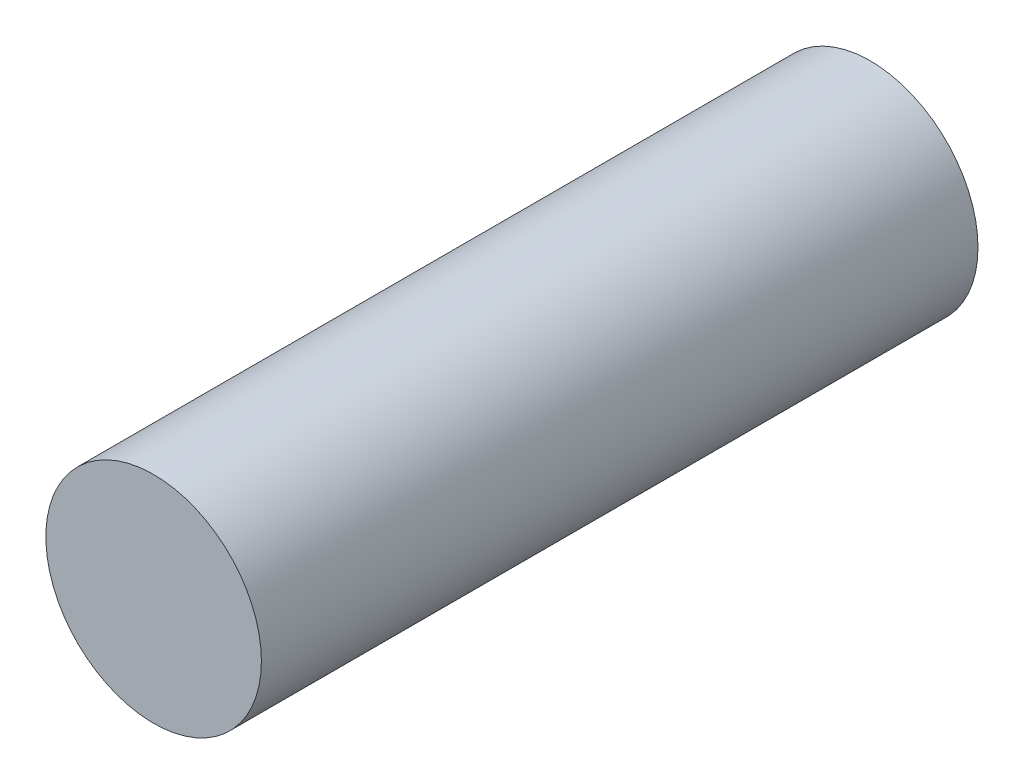
ISO-10303-21;
HEADER;
FILE_DESCRIPTION(('STEP AP214'),'2;1');
FILE_NAME('part.step','',(''),(''),'','','');
FILE_SCHEMA(('AUTOMOTIVE_DESIGN { 1 0 10303 214 1 1 1 1 }'));
ENDSEC;
DATA;
#1=APPLICATION_CONTEXT('core data for automotive mechanical design processes');
#2=APPLICATION_PROTOCOL_DEFINITION('international standard','automotive_design',2000,#1);
#3=PRODUCT_CONTEXT('',#1,'mechanical');
#4=PRODUCT('Part','Part','',(#3));
#5=PRODUCT_RELATED_PRODUCT_CATEGORY('part','',(#4));
#6=PRODUCT_DEFINITION_FORMATION('','',#4);
#7=PRODUCT_DEFINITION_CONTEXT('part definition',#1,'design');
#8=PRODUCT_DEFINITION('design','',#6,#7);
#9=PRODUCT_DEFINITION_SHAPE('','',#8);
#10=(LENGTH_UNIT() NAMED_UNIT(*) SI_UNIT(.MILLI.,.METRE.));
#11=(NAMED_UNIT(*) PLANE_ANGLE_UNIT() SI_UNIT($,.RADIAN.));
#12=(NAMED_UNIT(*) SI_UNIT($,.STERADIAN.) SOLID_ANGLE_UNIT());
#13=UNCERTAINTY_MEASURE_WITH_UNIT(LENGTH_MEASURE(1.E-05),#10,'distance_accuracy_value','');
#14=(GEOMETRIC_REPRESENTATION_CONTEXT(3) GLOBAL_UNCERTAINTY_ASSIGNED_CONTEXT((#13)) GLOBAL_UNIT_ASSIGNED_CONTEXT((#10,
#11,#12)) REPRESENTATION_CONTEXT('',''));
#15=CARTESIAN_POINT('',(0.,0.,0.));
#16=DIRECTION('',(0.,0.,1.));
#17=DIRECTION('',(1.,0.,0.));
#18=AXIS2_PLACEMENT_3D('',#15,#16,#17);
#19=CARTESIAN_POINT('',(0.,0.,246.));
#20=DIRECTION('',(0.,0.,-1.));
#21=DIRECTION('',(-1.,0.,0.));
#22=AXIS2_PLACEMENT_3D('',#19,#20,#21);
#23=CYLINDRICAL_SURFACE('',#22,37.);
#24=CARTESIAN_POINT('',(0.,0.,246.));
#25=DIRECTION('',(0.,0.,1.));
#26=DIRECTION('',(1.,0.,0.));
#27=AXIS2_PLACEMENT_3D('',#24,#25,#26);
#28=CIRCLE('',#27,37.);
#29=CARTESIAN_POINT('',(37.,0.,246.));
#30=VERTEX_POINT('',#29);
#31=EDGE_CURVE('E10',#30,#30,#28,.T.);
#32=ORIENTED_EDGE('',*,*,#31,.F.);
#33=EDGE_LOOP('',(#32));
#34=FACE_BOUND('',#33,.T.);
#35=CARTESIAN_POINT('',(0.,0.,0.));
#36=DIRECTION('',(0.,0.,1.));
#37=DIRECTION('',(1.,0.,0.));
#38=AXIS2_PLACEMENT_3D('',#35,#36,#37);
#39=CIRCLE('',#38,37.);
#40=CARTESIAN_POINT('',(37.,0.,0.));
#41=VERTEX_POINT('',#40);
#42=EDGE_CURVE('E40',#41,#41,#39,.T.);
#43=ORIENTED_EDGE('',*,*,#42,.T.);
#44=EDGE_LOOP('',(#43));
#45=FACE_BOUND('',#44,.T.);
#46=ADVANCED_FACE('F37',(#34,#45),#23,.T.);
#47=CARTESIAN_POINT('',(0.,0.,246.));
#48=DIRECTION('',(0.,0.,1.));
#49=DIRECTION('',(1.,0.,0.));
#50=AXIS2_PLACEMENT_3D('',#47,#48,#49);
#51=PLANE('',#50);
#52=ORIENTED_EDGE('',*,*,#31,.T.);
#53=EDGE_LOOP('',(#52));
#54=FACE_BOUND('',#53,.T.);
#55=ADVANCED_FACE('F52',(#54),#51,.T.);
#56=CARTESIAN_POINT('',(0.,0.,0.));
#57=DIRECTION('',(0.,0.,1.));
#58=DIRECTION('',(1.,0.,0.));
#59=AXIS2_PLACEMENT_3D('',#56,#57,#58);
#60=PLANE('',#59);
#61=ORIENTED_EDGE('',*,*,#42,.F.);
#62=EDGE_LOOP('',(#61));
#63=FACE_BOUND('',#62,.T.);
#64=ADVANCED_FACE('F50',(#63),#60,.F.);
#65=CLOSED_SHELL('',(#46,#55,#64));
#66=MANIFOLD_SOLID_BREP('B2',#65);
#67=ADVANCED_BREP_SHAPE_REPRESENTATION('',(#18,#66),#14);
#68=SHAPE_DEFINITION_REPRESENTATION(#9,#67);
ENDSEC;
END-ISO-10303-21;
